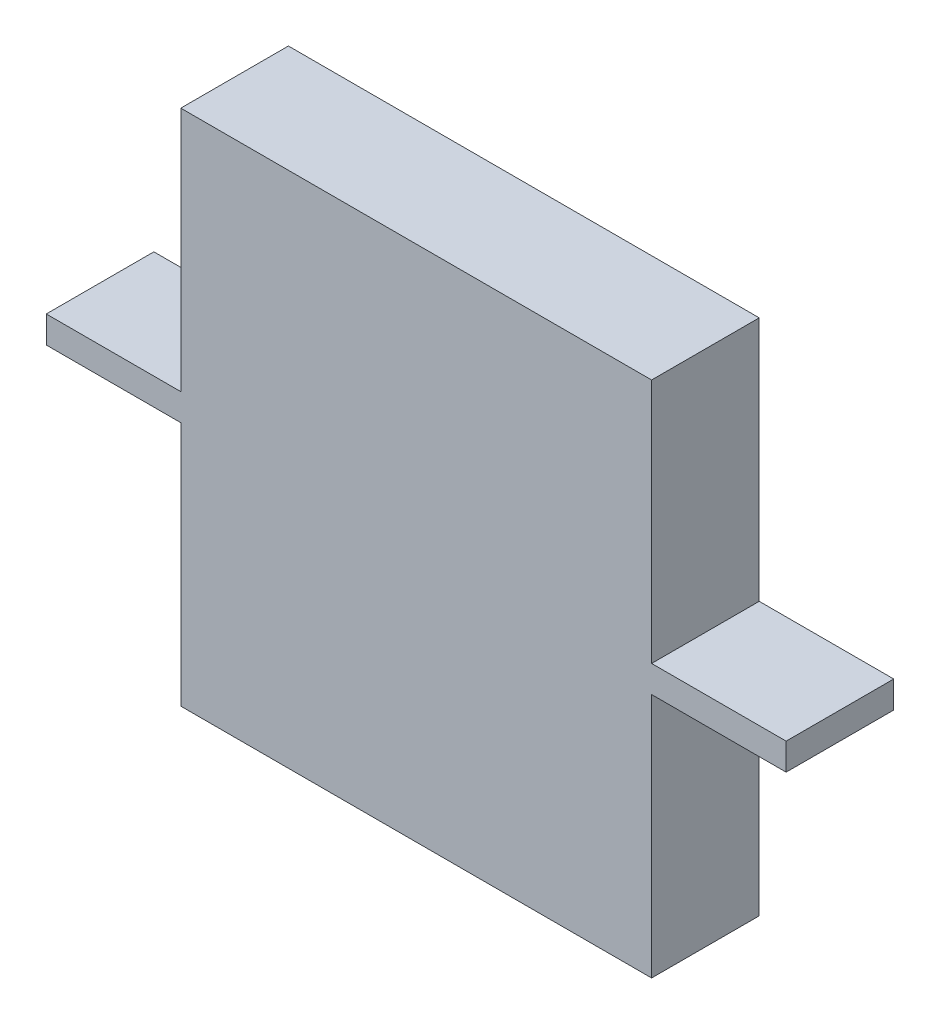
ISO-10303-21;
HEADER;
FILE_DESCRIPTION(('STEP AP214'),'2;1');
FILE_NAME('part.step','',(''),(''),'','','');
FILE_SCHEMA(('AUTOMOTIVE_DESIGN { 1 0 10303 214 1 1 1 1 }'));
ENDSEC;
DATA;
#1=APPLICATION_CONTEXT('core data for automotive mechanical design processes');
#2=APPLICATION_PROTOCOL_DEFINITION('international standard','automotive_design',2000,#1);
#3=PRODUCT_CONTEXT('',#1,'mechanical');
#4=PRODUCT('Part','Part','',(#3));
#5=PRODUCT_RELATED_PRODUCT_CATEGORY('part','',(#4));
#6=PRODUCT_DEFINITION_FORMATION('','',#4);
#7=PRODUCT_DEFINITION_CONTEXT('part definition',#1,'design');
#8=PRODUCT_DEFINITION('design','',#6,#7);
#9=PRODUCT_DEFINITION_SHAPE('','',#8);
#10=(LENGTH_UNIT() NAMED_UNIT(*) SI_UNIT(.MILLI.,.METRE.));
#11=(NAMED_UNIT(*) PLANE_ANGLE_UNIT() SI_UNIT($,.RADIAN.));
#12=(NAMED_UNIT(*) SI_UNIT($,.STERADIAN.) SOLID_ANGLE_UNIT());
#13=UNCERTAINTY_MEASURE_WITH_UNIT(LENGTH_MEASURE(1.E-05),#10,'distance_accuracy_value','');
#14=(GEOMETRIC_REPRESENTATION_CONTEXT(3) GLOBAL_UNCERTAINTY_ASSIGNED_CONTEXT((#13)) GLOBAL_UNIT_ASSIGNED_CONTEXT((#10,
#11,#12)) REPRESENTATION_CONTEXT('',''));
#15=CARTESIAN_POINT('',(0.,0.,0.));
#16=DIRECTION('',(0.,0.,1.));
#17=DIRECTION('',(1.,0.,0.));
#18=AXIS2_PLACEMENT_3D('',#15,#16,#17);
#19=CARTESIAN_POINT('',(0.,20.25,8.));
#20=DIRECTION('',(0.,-1.,0.));
#21=DIRECTION('',(1.,0.,0.));
#22=AXIS2_PLACEMENT_3D('',#19,#20,#21);
#23=PLANE('',#22);
#24=DIRECTION('',(-1.,0.,0.));
#25=VECTOR('',#24,1.);
#26=CARTESIAN_POINT('',(0.,20.25,0.));
#27=LINE('',#26,#25);
#28=CARTESIAN_POINT('',(0.,20.25,0.));
#29=VERTEX_POINT('',#28);
#30=CARTESIAN_POINT('',(-10.,20.25,0.));
#31=VERTEX_POINT('',#30);
#32=EDGE_CURVE('E159',#29,#31,#27,.T.);
#33=ORIENTED_EDGE('',*,*,#32,.T.);
#34=DIRECTION('',(0.,0.,-1.));
#35=VECTOR('',#34,1.);
#36=CARTESIAN_POINT('',(-10.,20.25,8.));
#37=LINE('',#36,#35);
#38=CARTESIAN_POINT('',(-10.,20.25,8.));
#39=VERTEX_POINT('',#38);
#40=EDGE_CURVE('E11',#39,#31,#37,.T.);
#41=ORIENTED_EDGE('',*,*,#40,.F.);
#42=DIRECTION('',(-1.,0.,0.));
#43=VECTOR('',#42,1.);
#44=CARTESIAN_POINT('',(0.,20.25,8.));
#45=LINE('',#44,#43);
#46=CARTESIAN_POINT('',(0.,20.25,8.));
#47=VERTEX_POINT('',#46);
#48=EDGE_CURVE('E222',#47,#39,#45,.T.);
#49=ORIENTED_EDGE('',*,*,#48,.F.);
#50=DIRECTION('',(0.,0.,-1.));
#51=VECTOR('',#50,1.);
#52=CARTESIAN_POINT('',(0.,20.25,8.));
#53=LINE('',#52,#51);
#54=EDGE_CURVE('E51',#47,#29,#53,.T.);
#55=ORIENTED_EDGE('',*,*,#54,.T.);
#56=EDGE_LOOP('',(#33,#41,#49,#55));
#57=FACE_BOUND('',#56,.T.);
#58=ADVANCED_FACE('F35',(#57),#23,.F.);
#59=CARTESIAN_POINT('',(-10.,0.,8.));
#60=DIRECTION('',(1.,0.,0.));
#61=DIRECTION('',(0.,0.,-1.));
#62=AXIS2_PLACEMENT_3D('',#59,#60,#61);
#63=PLANE('',#62);
#64=DIRECTION('',(0.,-1.,0.));
#65=VECTOR('',#64,1.);
#66=CARTESIAN_POINT('',(-10.,0.,0.));
#67=LINE('',#66,#65);
#68=CARTESIAN_POINT('',(-10.,18.25,0.));
#69=VERTEX_POINT('',#68);
#70=EDGE_CURVE('E161',#31,#69,#67,.T.);
#71=ORIENTED_EDGE('',*,*,#70,.T.);
#72=DIRECTION('',(0.,0.,-1.));
#73=VECTOR('',#72,1.);
#74=CARTESIAN_POINT('',(-10.,18.25,8.));
#75=LINE('',#74,#73);
#76=CARTESIAN_POINT('',(-10.,18.25,8.));
#77=VERTEX_POINT('',#76);
#78=EDGE_CURVE('E43',#77,#69,#75,.T.);
#79=ORIENTED_EDGE('',*,*,#78,.F.);
#80=DIRECTION('',(0.,-1.,0.));
#81=VECTOR('',#80,1.);
#82=CARTESIAN_POINT('',(-10.,0.,8.));
#83=LINE('',#82,#81);
#84=EDGE_CURVE('E101',#39,#77,#83,.T.);
#85=ORIENTED_EDGE('',*,*,#84,.F.);
#86=ORIENTED_EDGE('',*,*,#40,.T.);
#87=EDGE_LOOP('',(#71,#79,#85,#86));
#88=FACE_BOUND('',#87,.T.);
#89=ADVANCED_FACE('F208',(#88),#63,.F.);
#90=CARTESIAN_POINT('',(0.,18.25,8.));
#91=DIRECTION('',(0.,-1.,0.));
#92=DIRECTION('',(0.,0.,-1.));
#93=AXIS2_PLACEMENT_3D('',#90,#91,#92);
#94=PLANE('',#93);
#95=DIRECTION('',(-1.,0.,0.));
#96=VECTOR('',#95,1.);
#97=CARTESIAN_POINT('',(0.,18.25,0.));
#98=LINE('',#97,#96);
#99=CARTESIAN_POINT('',(0.,18.25,0.));
#100=VERTEX_POINT('',#99);
#101=EDGE_CURVE('E164',#100,#69,#98,.T.);
#102=ORIENTED_EDGE('',*,*,#101,.F.);
#103=DIRECTION('',(0.,0.,-1.));
#104=VECTOR('',#103,1.);
#105=CARTESIAN_POINT('',(0.,18.25,8.));
#106=LINE('',#105,#104);
#107=CARTESIAN_POINT('',(0.,18.25,8.));
#108=VERTEX_POINT('',#107);
#109=EDGE_CURVE('E201',#108,#100,#106,.T.);
#110=ORIENTED_EDGE('',*,*,#109,.F.);
#111=DIRECTION('',(-1.,0.,0.));
#112=VECTOR('',#111,1.);
#113=CARTESIAN_POINT('',(0.,18.25,8.));
#114=LINE('',#113,#112);
#115=EDGE_CURVE('E207',#108,#77,#114,.T.);
#116=ORIENTED_EDGE('',*,*,#115,.T.);
#117=ORIENTED_EDGE('',*,*,#78,.T.);
#118=EDGE_LOOP('',(#102,#110,#116,#117));
#119=FACE_BOUND('',#118,.T.);
#120=ADVANCED_FACE('F205',(#119),#94,.T.);
#121=CARTESIAN_POINT('',(0.,0.,8.));
#122=DIRECTION('',(-1.,0.,0.));
#123=DIRECTION('',(0.,0.,1.));
#124=AXIS2_PLACEMENT_3D('',#121,#122,#123);
#125=PLANE('',#124);
#126=DIRECTION('',(0.,1.,0.));
#127=VECTOR('',#126,1.);
#128=CARTESIAN_POINT('',(0.,0.,0.));
#129=LINE('',#128,#127);
#130=CARTESIAN_POINT('',(0.,0.,0.));
#131=VERTEX_POINT('',#130);
#132=EDGE_CURVE('E167',#131,#100,#129,.T.);
#133=ORIENTED_EDGE('',*,*,#132,.F.);
#134=DIRECTION('',(0.,0.,-1.));
#135=VECTOR('',#134,1.);
#136=CARTESIAN_POINT('',(0.,0.,8.));
#137=LINE('',#136,#135);
#138=CARTESIAN_POINT('',(0.,0.,8.));
#139=VERTEX_POINT('',#138);
#140=EDGE_CURVE('E199',#139,#131,#137,.T.);
#141=ORIENTED_EDGE('',*,*,#140,.F.);
#142=DIRECTION('',(0.,1.,0.));
#143=VECTOR('',#142,1.);
#144=CARTESIAN_POINT('',(0.,0.,8.));
#145=LINE('',#144,#143);
#146=EDGE_CURVE('E155',#139,#108,#145,.T.);
#147=ORIENTED_EDGE('',*,*,#146,.T.);
#148=ORIENTED_EDGE('',*,*,#109,.T.);
#149=EDGE_LOOP('',(#133,#141,#147,#148));
#150=FACE_BOUND('',#149,.T.);
#151=ADVANCED_FACE('F216',(#150),#125,.T.);
#152=CARTESIAN_POINT('',(0.,0.,8.));
#153=DIRECTION('',(0.,1.,0.));
#154=DIRECTION('',(0.,0.,1.));
#155=AXIS2_PLACEMENT_3D('',#152,#153,#154);
#156=PLANE('',#155);
#157=DIRECTION('',(1.,0.,0.));
#158=VECTOR('',#157,1.);
#159=CARTESIAN_POINT('',(0.,0.,0.));
#160=LINE('',#159,#158);
#161=CARTESIAN_POINT('',(35.,0.,0.));
#162=VERTEX_POINT('',#161);
#163=EDGE_CURVE('E170',#131,#162,#160,.T.);
#164=ORIENTED_EDGE('',*,*,#163,.T.);
#165=DIRECTION('',(0.,0.,-1.));
#166=VECTOR('',#165,1.);
#167=CARTESIAN_POINT('',(35.,0.,8.));
#168=LINE('',#167,#166);
#169=CARTESIAN_POINT('',(35.,0.,8.));
#170=VERTEX_POINT('',#169);
#171=EDGE_CURVE('E196',#170,#162,#168,.T.);
#172=ORIENTED_EDGE('',*,*,#171,.F.);
#173=DIRECTION('',(1.,0.,0.));
#174=VECTOR('',#173,1.);
#175=CARTESIAN_POINT('',(0.,0.,8.));
#176=LINE('',#175,#174);
#177=EDGE_CURVE('E221',#139,#170,#176,.T.);
#178=ORIENTED_EDGE('',*,*,#177,.F.);
#179=ORIENTED_EDGE('',*,*,#140,.T.);
#180=EDGE_LOOP('',(#164,#172,#178,#179));
#181=FACE_BOUND('',#180,.T.);
#182=ADVANCED_FACE('F245',(#181),#156,.F.);
#183=CARTESIAN_POINT('',(35.,0.,8.));
#184=DIRECTION('',(-1.,0.,0.));
#185=DIRECTION('',(0.,0.,1.));
#186=AXIS2_PLACEMENT_3D('',#183,#184,#185);
#187=PLANE('',#186);
#188=DIRECTION('',(0.,1.,0.));
#189=VECTOR('',#188,1.);
#190=CARTESIAN_POINT('',(35.,0.,0.));
#191=LINE('',#190,#189);
#192=CARTESIAN_POINT('',(35.,18.25,0.));
#193=VERTEX_POINT('',#192);
#194=EDGE_CURVE('E173',#162,#193,#191,.T.);
#195=ORIENTED_EDGE('',*,*,#194,.T.);
#196=DIRECTION('',(0.,0.,-1.));
#197=VECTOR('',#196,1.);
#198=CARTESIAN_POINT('',(35.,18.25,8.));
#199=LINE('',#198,#197);
#200=CARTESIAN_POINT('',(35.,18.25,8.));
#201=VERTEX_POINT('',#200);
#202=EDGE_CURVE('E193',#201,#193,#199,.T.);
#203=ORIENTED_EDGE('',*,*,#202,.F.);
#204=DIRECTION('',(0.,1.,0.));
#205=VECTOR('',#204,1.);
#206=CARTESIAN_POINT('',(35.,0.,8.));
#207=LINE('',#206,#205);
#208=EDGE_CURVE('E141',#170,#201,#207,.T.);
#209=ORIENTED_EDGE('',*,*,#208,.F.);
#210=ORIENTED_EDGE('',*,*,#171,.T.);
#211=EDGE_LOOP('',(#195,#203,#209,#210));
#212=FACE_BOUND('',#211,.T.);
#213=ADVANCED_FACE('F248',(#212),#187,.F.);
#214=CARTESIAN_POINT('',(0.,18.25,8.));
#215=DIRECTION('',(0.,1.,0.));
#216=DIRECTION('',(0.,0.,1.));
#217=AXIS2_PLACEMENT_3D('',#214,#215,#216);
#218=PLANE('',#217);
#219=DIRECTION('',(1.,0.,0.));
#220=VECTOR('',#219,1.);
#221=CARTESIAN_POINT('',(0.,18.25,0.));
#222=LINE('',#221,#220);
#223=CARTESIAN_POINT('',(45.,18.25,0.));
#224=VERTEX_POINT('',#223);
#225=EDGE_CURVE('E175',#193,#224,#222,.T.);
#226=ORIENTED_EDGE('',*,*,#225,.T.);
#227=DIRECTION('',(0.,0.,-1.));
#228=VECTOR('',#227,1.);
#229=CARTESIAN_POINT('',(45.,18.25,8.));
#230=LINE('',#229,#228);
#231=CARTESIAN_POINT('',(45.,18.25,8.));
#232=VERTEX_POINT('',#231);
#233=EDGE_CURVE('E191',#232,#224,#230,.T.);
#234=ORIENTED_EDGE('',*,*,#233,.F.);
#235=DIRECTION('',(1.,0.,0.));
#236=VECTOR('',#235,1.);
#237=CARTESIAN_POINT('',(0.,18.25,8.));
#238=LINE('',#237,#236);
#239=EDGE_CURVE('E227',#201,#232,#238,.T.);
#240=ORIENTED_EDGE('',*,*,#239,.F.);
#241=ORIENTED_EDGE('',*,*,#202,.T.);
#242=EDGE_LOOP('',(#226,#234,#240,#241));
#243=FACE_BOUND('',#242,.T.);
#244=ADVANCED_FACE('F250',(#243),#218,.F.);
#245=CARTESIAN_POINT('',(45.,0.,8.));
#246=DIRECTION('',(1.,0.,0.));
#247=DIRECTION('',(0.,0.,-1.));
#248=AXIS2_PLACEMENT_3D('',#245,#246,#247);
#249=PLANE('',#248);
#250=DIRECTION('',(0.,-1.,0.));
#251=VECTOR('',#250,1.);
#252=CARTESIAN_POINT('',(45.,0.,0.));
#253=LINE('',#252,#251);
#254=CARTESIAN_POINT('',(45.,20.25,0.));
#255=VERTEX_POINT('',#254);
#256=EDGE_CURVE('E178',#255,#224,#253,.T.);
#257=ORIENTED_EDGE('',*,*,#256,.F.);
#258=DIRECTION('',(0.,0.,-1.));
#259=VECTOR('',#258,1.);
#260=CARTESIAN_POINT('',(45.,20.25,8.));
#261=LINE('',#260,#259);
#262=CARTESIAN_POINT('',(45.,20.25,8.));
#263=VERTEX_POINT('',#262);
#264=EDGE_CURVE('E189',#263,#255,#261,.T.);
#265=ORIENTED_EDGE('',*,*,#264,.F.);
#266=DIRECTION('',(0.,-1.,0.));
#267=VECTOR('',#266,1.);
#268=CARTESIAN_POINT('',(45.,0.,8.));
#269=LINE('',#268,#267);
#270=EDGE_CURVE('E228',#263,#232,#269,.T.);
#271=ORIENTED_EDGE('',*,*,#270,.T.);
#272=ORIENTED_EDGE('',*,*,#233,.T.);
#273=EDGE_LOOP('',(#257,#265,#271,#272));
#274=FACE_BOUND('',#273,.T.);
#275=ADVANCED_FACE('F253',(#274),#249,.T.);
#276=CARTESIAN_POINT('',(0.,20.25,8.));
#277=DIRECTION('',(0.,1.,0.));
#278=DIRECTION('',(-1.,0.,0.));
#279=AXIS2_PLACEMENT_3D('',#276,#277,#278);
#280=PLANE('',#279);
#281=DIRECTION('',(1.,0.,0.));
#282=VECTOR('',#281,1.);
#283=CARTESIAN_POINT('',(0.,20.25,0.));
#284=LINE('',#283,#282);
#285=CARTESIAN_POINT('',(35.,20.25,0.));
#286=VERTEX_POINT('',#285);
#287=EDGE_CURVE('E181',#286,#255,#284,.T.);
#288=ORIENTED_EDGE('',*,*,#287,.F.);
#289=DIRECTION('',(0.,0.,-1.));
#290=VECTOR('',#289,1.);
#291=CARTESIAN_POINT('',(35.,20.25,8.));
#292=LINE('',#291,#290);
#293=CARTESIAN_POINT('',(35.,20.25,8.));
#294=VERTEX_POINT('',#293);
#295=EDGE_CURVE('E149',#294,#286,#292,.T.);
#296=ORIENTED_EDGE('',*,*,#295,.F.);
#297=DIRECTION('',(1.,0.,0.));
#298=VECTOR('',#297,1.);
#299=CARTESIAN_POINT('',(0.,20.25,8.));
#300=LINE('',#299,#298);
#301=EDGE_CURVE('E138',#294,#263,#300,.T.);
#302=ORIENTED_EDGE('',*,*,#301,.T.);
#303=ORIENTED_EDGE('',*,*,#264,.T.);
#304=EDGE_LOOP('',(#288,#296,#302,#303));
#305=FACE_BOUND('',#304,.T.);
#306=ADVANCED_FACE('F233',(#305),#280,.T.);
#307=CARTESIAN_POINT('',(35.,38.5,0.));
#308=VERTEX_POINT('',#307);
#309=EDGE_CURVE('E146',#286,#308,#191,.T.);
#310=ORIENTED_EDGE('',*,*,#309,.T.);
#311=DIRECTION('',(0.,0.,-1.));
#312=VECTOR('',#311,1.);
#313=CARTESIAN_POINT('',(35.,38.5,8.));
#314=LINE('',#313,#312);
#315=CARTESIAN_POINT('',(35.,38.5,8.));
#316=VERTEX_POINT('',#315);
#317=EDGE_CURVE('E143',#316,#308,#314,.T.);
#318=ORIENTED_EDGE('',*,*,#317,.F.);
#319=EDGE_CURVE('E130',#294,#316,#207,.T.);
#320=ORIENTED_EDGE('',*,*,#319,.F.);
#321=ORIENTED_EDGE('',*,*,#295,.T.);
#322=EDGE_LOOP('',(#310,#318,#320,#321));
#323=FACE_BOUND('',#322,.T.);
#324=ADVANCED_FACE('F144',(#323),#187,.F.);
#325=CARTESIAN_POINT('',(0.,38.5,8.));
#326=DIRECTION('',(0.,1.,0.));
#327=DIRECTION('',(0.,0.,1.));
#328=AXIS2_PLACEMENT_3D('',#325,#326,#327);
#329=PLANE('',#328);
#330=DIRECTION('',(1.,0.,0.));
#331=VECTOR('',#330,1.);
#332=CARTESIAN_POINT('',(0.,38.5,0.));
#333=LINE('',#332,#331);
#334=CARTESIAN_POINT('',(0.,38.5,0.));
#335=VERTEX_POINT('',#334);
#336=EDGE_CURVE('E184',#335,#308,#333,.T.);
#337=ORIENTED_EDGE('',*,*,#336,.F.);
#338=DIRECTION('',(0.,0.,-1.));
#339=VECTOR('',#338,1.);
#340=CARTESIAN_POINT('',(0.,38.5,8.));
#341=LINE('',#340,#339);
#342=CARTESIAN_POINT('',(0.,38.5,8.));
#343=VERTEX_POINT('',#342);
#344=EDGE_CURVE('E89',#343,#335,#341,.T.);
#345=ORIENTED_EDGE('',*,*,#344,.F.);
#346=DIRECTION('',(1.,0.,0.));
#347=VECTOR('',#346,1.);
#348=CARTESIAN_POINT('',(0.,38.5,8.));
#349=LINE('',#348,#347);
#350=EDGE_CURVE('E135',#343,#316,#349,.T.);
#351=ORIENTED_EDGE('',*,*,#350,.T.);
#352=ORIENTED_EDGE('',*,*,#317,.T.);
#353=EDGE_LOOP('',(#337,#345,#351,#352));
#354=FACE_BOUND('',#353,.T.);
#355=ADVANCED_FACE('F151',(#354),#329,.T.);
#356=EDGE_CURVE('E171',#29,#335,#129,.T.);
#357=ORIENTED_EDGE('',*,*,#356,.F.);
#358=ORIENTED_EDGE('',*,*,#54,.F.);
#359=EDGE_CURVE('E152',#47,#343,#145,.T.);
#360=ORIENTED_EDGE('',*,*,#359,.T.);
#361=ORIENTED_EDGE('',*,*,#344,.T.);
#362=EDGE_LOOP('',(#357,#358,#360,#361));
#363=FACE_BOUND('',#362,.T.);
#364=ADVANCED_FACE('F263',(#363),#125,.T.);
#365=CARTESIAN_POINT('',(0.,0.,8.));
#366=DIRECTION('',(0.,0.,1.));
#367=DIRECTION('',(1.,0.,0.));
#368=AXIS2_PLACEMENT_3D('',#365,#366,#367);
#369=PLANE('',#368);
#370=ORIENTED_EDGE('',*,*,#48,.T.);
#371=ORIENTED_EDGE('',*,*,#84,.T.);
#372=ORIENTED_EDGE('',*,*,#115,.F.);
#373=ORIENTED_EDGE('',*,*,#146,.F.);
#374=ORIENTED_EDGE('',*,*,#177,.T.);
#375=ORIENTED_EDGE('',*,*,#208,.T.);
#376=ORIENTED_EDGE('',*,*,#239,.T.);
#377=ORIENTED_EDGE('',*,*,#270,.F.);
#378=ORIENTED_EDGE('',*,*,#301,.F.);
#379=ORIENTED_EDGE('',*,*,#319,.T.);
#380=ORIENTED_EDGE('',*,*,#350,.F.);
#381=ORIENTED_EDGE('',*,*,#359,.F.);
#382=EDGE_LOOP('',(#370,#371,#372,#373,#374,#375,#376,#377,#378,#379,#380,#381));
#383=FACE_BOUND('',#382,.T.);
#384=ADVANCED_FACE('F132',(#383),#369,.T.);
#385=CARTESIAN_POINT('',(0.,0.,0.));
#386=DIRECTION('',(0.,0.,1.));
#387=DIRECTION('',(1.,0.,0.));
#388=AXIS2_PLACEMENT_3D('',#385,#386,#387);
#389=PLANE('',#388);
#390=ORIENTED_EDGE('',*,*,#32,.F.);
#391=ORIENTED_EDGE('',*,*,#356,.T.);
#392=ORIENTED_EDGE('',*,*,#336,.T.);
#393=ORIENTED_EDGE('',*,*,#309,.F.);
#394=ORIENTED_EDGE('',*,*,#287,.T.);
#395=ORIENTED_EDGE('',*,*,#256,.T.);
#396=ORIENTED_EDGE('',*,*,#225,.F.);
#397=ORIENTED_EDGE('',*,*,#194,.F.);
#398=ORIENTED_EDGE('',*,*,#163,.F.);
#399=ORIENTED_EDGE('',*,*,#132,.T.);
#400=ORIENTED_EDGE('',*,*,#101,.T.);
#401=ORIENTED_EDGE('',*,*,#70,.F.);
#402=EDGE_LOOP('',(#390,#391,#392,#393,#394,#395,#396,#397,#398,#399,#400,#401));
#403=FACE_BOUND('',#402,.T.);
#404=ADVANCED_FACE('F211',(#403),#389,.F.);
#405=CLOSED_SHELL('',(#58,#89,#120,#151,#182,#213,#244,#275,#306,#324,#355,#364,#384,#404));
#406=MANIFOLD_SOLID_BREP('B2',#405);
#407=ADVANCED_BREP_SHAPE_REPRESENTATION('',(#18,#406),#14);
#408=SHAPE_DEFINITION_REPRESENTATION(#9,#407);
ENDSEC;
END-ISO-10303-21;
